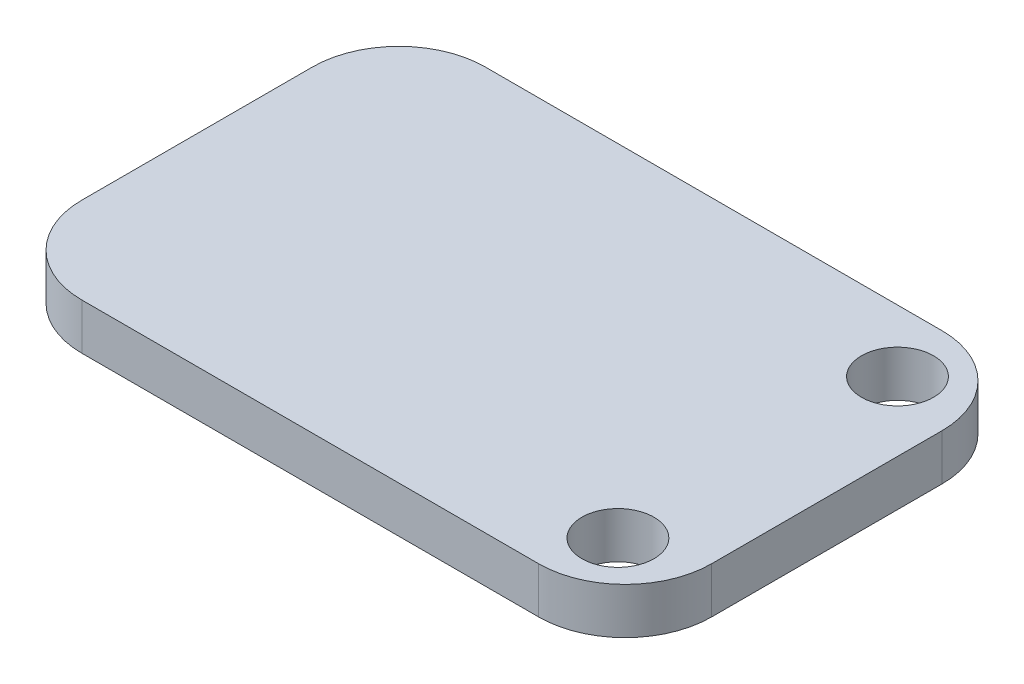
ISO-10303-21;
HEADER;
FILE_DESCRIPTION(('STEP AP214'),'2;1');
FILE_NAME('part.step','',(''),(''),'','','');
FILE_SCHEMA(('AUTOMOTIVE_DESIGN { 1 0 10303 214 1 1 1 1 }'));
ENDSEC;
DATA;
#1=APPLICATION_CONTEXT('core data for automotive mechanical design processes');
#2=APPLICATION_PROTOCOL_DEFINITION('international standard','automotive_design',2000,#1);
#3=PRODUCT_CONTEXT('',#1,'mechanical');
#4=PRODUCT('Part','Part','',(#3));
#5=PRODUCT_RELATED_PRODUCT_CATEGORY('part','',(#4));
#6=PRODUCT_DEFINITION_FORMATION('','',#4);
#7=PRODUCT_DEFINITION_CONTEXT('part definition',#1,'design');
#8=PRODUCT_DEFINITION('design','',#6,#7);
#9=PRODUCT_DEFINITION_SHAPE('','',#8);
#10=(LENGTH_UNIT() NAMED_UNIT(*) SI_UNIT(.MILLI.,.METRE.));
#11=(NAMED_UNIT(*) PLANE_ANGLE_UNIT() SI_UNIT($,.RADIAN.));
#12=(NAMED_UNIT(*) SI_UNIT($,.STERADIAN.) SOLID_ANGLE_UNIT());
#13=UNCERTAINTY_MEASURE_WITH_UNIT(LENGTH_MEASURE(1.E-05),#10,'distance_accuracy_value','');
#14=(GEOMETRIC_REPRESENTATION_CONTEXT(3) GLOBAL_UNCERTAINTY_ASSIGNED_CONTEXT((#13)) GLOBAL_UNIT_ASSIGNED_CONTEXT((#10,
#11,#12)) REPRESENTATION_CONTEXT('',''));
#15=CARTESIAN_POINT('',(0.,0.,0.));
#16=DIRECTION('',(0.,0.,1.));
#17=DIRECTION('',(1.,0.,0.));
#18=AXIS2_PLACEMENT_3D('',#15,#16,#17);
#19=CARTESIAN_POINT('',(-11.1,-1.6,-4.));
#20=DIRECTION('',(0.,1.,0.));
#21=DIRECTION('',(0.,0.,1.));
#22=AXIS2_PLACEMENT_3D('',#19,#20,#21);
#23=CYLINDRICAL_SURFACE('',#22,3.);
#24=CARTESIAN_POINT('',(-11.1,0.,-4.));
#25=DIRECTION('',(0.,1.,0.));
#26=DIRECTION('',(0.,0.,1.));
#27=AXIS2_PLACEMENT_3D('',#24,#25,#26);
#28=CIRCLE('',#27,3.);
#29=CARTESIAN_POINT('',(-11.1,0.,-7.));
#30=VERTEX_POINT('',#29);
#31=CARTESIAN_POINT('',(-14.1,0.,-3.99999999999998));
#32=VERTEX_POINT('',#31);
#33=EDGE_CURVE('E130',#30,#32,#28,.T.);
#34=ORIENTED_EDGE('',*,*,#33,.F.);
#35=DIRECTION('',(0.,1.,0.));
#36=VECTOR('',#35,1.);
#37=CARTESIAN_POINT('',(-11.1,-1.6,-7.));
#38=LINE('',#37,#36);
#39=CARTESIAN_POINT('',(-11.1,-1.6,-7.));
#40=VERTEX_POINT('',#39);
#41=EDGE_CURVE('E11',#40,#30,#38,.T.);
#42=ORIENTED_EDGE('',*,*,#41,.F.);
#43=CARTESIAN_POINT('',(-11.1,-1.6,-4.));
#44=DIRECTION('',(0.,1.,0.));
#45=DIRECTION('',(0.,0.,1.));
#46=AXIS2_PLACEMENT_3D('',#43,#44,#45);
#47=CIRCLE('',#46,3.);
#48=CARTESIAN_POINT('',(-14.1,-1.6,-3.99999999999998));
#49=VERTEX_POINT('',#48);
#50=EDGE_CURVE('E151',#40,#49,#47,.T.);
#51=ORIENTED_EDGE('',*,*,#50,.T.);
#52=DIRECTION('',(0.,1.,0.));
#53=VECTOR('',#52,1.);
#54=CARTESIAN_POINT('',(-14.1,-1.6,-3.99999999999998));
#55=LINE('',#54,#53);
#56=EDGE_CURVE('E36',#49,#32,#55,.T.);
#57=ORIENTED_EDGE('',*,*,#56,.T.);
#58=EDGE_LOOP('',(#34,#42,#51,#57));
#59=FACE_BOUND('',#58,.T.);
#60=ADVANCED_FACE('F33',(#59),#23,.T.);
#61=CARTESIAN_POINT('',(-11.1,-1.6,-7.));
#62=DIRECTION('',(0.,0.,-1.));
#63=DIRECTION('',(-1.,0.,0.));
#64=AXIS2_PLACEMENT_3D('',#61,#62,#63);
#65=PLANE('',#64);
#66=DIRECTION('',(-1.,0.,0.));
#67=VECTOR('',#66,1.);
#68=CARTESIAN_POINT('',(-11.1,0.,-7.));
#69=LINE('',#68,#67);
#70=CARTESIAN_POINT('',(4.74999999999998,0.,-7.));
#71=VERTEX_POINT('',#70);
#72=EDGE_CURVE('E149',#71,#30,#69,.T.);
#73=ORIENTED_EDGE('',*,*,#72,.F.);
#74=DIRECTION('',(0.,1.,0.));
#75=VECTOR('',#74,1.);
#76=CARTESIAN_POINT('',(4.74999999999998,-1.6,-7.));
#77=LINE('',#76,#75);
#78=CARTESIAN_POINT('',(4.74999999999998,-1.6,-7.));
#79=VERTEX_POINT('',#78);
#80=EDGE_CURVE('E42',#79,#71,#77,.T.);
#81=ORIENTED_EDGE('',*,*,#80,.F.);
#82=DIRECTION('',(-1.,0.,0.));
#83=VECTOR('',#82,1.);
#84=CARTESIAN_POINT('',(-11.1,-1.6,-7.));
#85=LINE('',#84,#83);
#86=EDGE_CURVE('E120',#79,#40,#85,.T.);
#87=ORIENTED_EDGE('',*,*,#86,.T.);
#88=ORIENTED_EDGE('',*,*,#41,.T.);
#89=EDGE_LOOP('',(#73,#81,#87,#88));
#90=FACE_BOUND('',#89,.T.);
#91=ADVANCED_FACE('F163',(#90),#65,.T.);
#92=CARTESIAN_POINT('',(4.75,-1.6,-4.));
#93=DIRECTION('',(0.,1.,0.));
#94=DIRECTION('',(0.,0.,1.));
#95=AXIS2_PLACEMENT_3D('',#92,#93,#94);
#96=CYLINDRICAL_SURFACE('',#95,3.);
#97=CARTESIAN_POINT('',(4.75,0.,-4.));
#98=DIRECTION('',(0.,1.,0.));
#99=DIRECTION('',(0.,0.,-1.));
#100=AXIS2_PLACEMENT_3D('',#97,#98,#99);
#101=CIRCLE('',#100,3.);
#102=CARTESIAN_POINT('',(7.75,0.,-3.99999999999998));
#103=VERTEX_POINT('',#102);
#104=EDGE_CURVE('E107',#103,#71,#101,.T.);
#105=ORIENTED_EDGE('',*,*,#104,.F.);
#106=DIRECTION('',(0.,1.,0.));
#107=VECTOR('',#106,1.);
#108=CARTESIAN_POINT('',(7.75,-1.6,-3.99999999999998));
#109=LINE('',#108,#107);
#110=CARTESIAN_POINT('',(7.75,-1.6,-3.99999999999998));
#111=VERTEX_POINT('',#110);
#112=EDGE_CURVE('E102',#111,#103,#109,.T.);
#113=ORIENTED_EDGE('',*,*,#112,.F.);
#114=CARTESIAN_POINT('',(4.75,-1.6,-4.));
#115=DIRECTION('',(0.,1.,0.));
#116=DIRECTION('',(0.,0.,-1.));
#117=AXIS2_PLACEMENT_3D('',#114,#115,#116);
#118=CIRCLE('',#117,3.);
#119=EDGE_CURVE('E105',#111,#79,#118,.T.);
#120=ORIENTED_EDGE('',*,*,#119,.T.);
#121=ORIENTED_EDGE('',*,*,#80,.T.);
#122=EDGE_LOOP('',(#105,#113,#120,#121));
#123=FACE_BOUND('',#122,.T.);
#124=ADVANCED_FACE('F104',(#123),#96,.T.);
#125=CARTESIAN_POINT('',(7.75,-1.6,-3.99999999999998));
#126=DIRECTION('',(1.,0.,0.));
#127=DIRECTION('',(0.,0.,-1.));
#128=AXIS2_PLACEMENT_3D('',#125,#126,#127);
#129=PLANE('',#128);
#130=DIRECTION('',(0.,0.,-1.));
#131=VECTOR('',#130,1.);
#132=CARTESIAN_POINT('',(7.75,0.,-3.99999999999998));
#133=LINE('',#132,#131);
#134=CARTESIAN_POINT('',(7.75,0.,3.99999999999998));
#135=VERTEX_POINT('',#134);
#136=EDGE_CURVE('E146',#135,#103,#133,.T.);
#137=ORIENTED_EDGE('',*,*,#136,.F.);
#138=DIRECTION('',(0.,1.,0.));
#139=VECTOR('',#138,1.);
#140=CARTESIAN_POINT('',(7.75,-1.6,3.99999999999998));
#141=LINE('',#140,#139);
#142=CARTESIAN_POINT('',(7.75,-1.6,3.99999999999998));
#143=VERTEX_POINT('',#142);
#144=EDGE_CURVE('E112',#143,#135,#141,.T.);
#145=ORIENTED_EDGE('',*,*,#144,.F.);
#146=DIRECTION('',(0.,0.,-1.));
#147=VECTOR('',#146,1.);
#148=CARTESIAN_POINT('',(7.75,-1.6,-3.99999999999998));
#149=LINE('',#148,#147);
#150=EDGE_CURVE('E118',#143,#111,#149,.T.);
#151=ORIENTED_EDGE('',*,*,#150,.T.);
#152=ORIENTED_EDGE('',*,*,#112,.T.);
#153=EDGE_LOOP('',(#137,#145,#151,#152));
#154=FACE_BOUND('',#153,.T.);
#155=ADVANCED_FACE('F122',(#154),#129,.T.);
#156=CARTESIAN_POINT('',(4.75,-1.6,4.));
#157=DIRECTION('',(0.,1.,0.));
#158=DIRECTION('',(0.,0.,1.));
#159=AXIS2_PLACEMENT_3D('',#156,#157,#158);
#160=CYLINDRICAL_SURFACE('',#159,3.);
#161=CARTESIAN_POINT('',(4.75,0.,4.));
#162=DIRECTION('',(0.,1.,0.));
#163=DIRECTION('',(0.,0.,1.));
#164=AXIS2_PLACEMENT_3D('',#161,#162,#163);
#165=CIRCLE('',#164,3.);
#166=CARTESIAN_POINT('',(4.74999999999998,0.,7.));
#167=VERTEX_POINT('',#166);
#168=EDGE_CURVE('E143',#167,#135,#165,.T.);
#169=ORIENTED_EDGE('',*,*,#168,.F.);
#170=DIRECTION('',(0.,1.,0.));
#171=VECTOR('',#170,1.);
#172=CARTESIAN_POINT('',(4.74999999999998,-1.6,7.));
#173=LINE('',#172,#171);
#174=CARTESIAN_POINT('',(4.74999999999998,-1.6,7.));
#175=VERTEX_POINT('',#174);
#176=EDGE_CURVE('E155',#175,#167,#173,.T.);
#177=ORIENTED_EDGE('',*,*,#176,.F.);
#178=CARTESIAN_POINT('',(4.75,-1.6,4.));
#179=DIRECTION('',(0.,1.,0.));
#180=DIRECTION('',(0.,0.,1.));
#181=AXIS2_PLACEMENT_3D('',#178,#179,#180);
#182=CIRCLE('',#181,3.);
#183=EDGE_CURVE('E123',#175,#143,#182,.T.);
#184=ORIENTED_EDGE('',*,*,#183,.T.);
#185=ORIENTED_EDGE('',*,*,#144,.T.);
#186=EDGE_LOOP('',(#169,#177,#184,#185));
#187=FACE_BOUND('',#186,.T.);
#188=ADVANCED_FACE('F176',(#187),#160,.T.);
#189=CARTESIAN_POINT('',(-11.1,-1.6,7.));
#190=DIRECTION('',(0.,0.,1.));
#191=DIRECTION('',(1.,0.,0.));
#192=AXIS2_PLACEMENT_3D('',#189,#190,#191);
#193=PLANE('',#192);
#194=DIRECTION('',(1.,0.,0.));
#195=VECTOR('',#194,1.);
#196=CARTESIAN_POINT('',(-11.1,0.,7.));
#197=LINE('',#196,#195);
#198=CARTESIAN_POINT('',(-11.1,0.,7.));
#199=VERTEX_POINT('',#198);
#200=EDGE_CURVE('E140',#199,#167,#197,.T.);
#201=ORIENTED_EDGE('',*,*,#200,.F.);
#202=DIRECTION('',(0.,1.,0.));
#203=VECTOR('',#202,1.);
#204=CARTESIAN_POINT('',(-11.1,-1.6,7.));
#205=LINE('',#204,#203);
#206=CARTESIAN_POINT('',(-11.1,-1.6,7.));
#207=VERTEX_POINT('',#206);
#208=EDGE_CURVE('E157',#207,#199,#205,.T.);
#209=ORIENTED_EDGE('',*,*,#208,.F.);
#210=DIRECTION('',(1.,0.,0.));
#211=VECTOR('',#210,1.);
#212=CARTESIAN_POINT('',(-11.1,-1.6,7.));
#213=LINE('',#212,#211);
#214=EDGE_CURVE('E125',#207,#175,#213,.T.);
#215=ORIENTED_EDGE('',*,*,#214,.T.);
#216=ORIENTED_EDGE('',*,*,#176,.T.);
#217=EDGE_LOOP('',(#201,#209,#215,#216));
#218=FACE_BOUND('',#217,.T.);
#219=ADVANCED_FACE('F179',(#218),#193,.T.);
#220=CARTESIAN_POINT('',(-11.1,-1.6,4.));
#221=DIRECTION('',(0.,1.,0.));
#222=DIRECTION('',(0.,0.,1.));
#223=AXIS2_PLACEMENT_3D('',#220,#221,#222);
#224=CYLINDRICAL_SURFACE('',#223,3.);
#225=CARTESIAN_POINT('',(-11.1,0.,4.));
#226=DIRECTION('',(0.,1.,0.));
#227=DIRECTION('',(0.,0.,1.));
#228=AXIS2_PLACEMENT_3D('',#225,#226,#227);
#229=CIRCLE('',#228,3.);
#230=CARTESIAN_POINT('',(-14.1,0.,3.99999999999998));
#231=VERTEX_POINT('',#230);
#232=EDGE_CURVE('E137',#231,#199,#229,.T.);
#233=ORIENTED_EDGE('',*,*,#232,.F.);
#234=DIRECTION('',(0.,1.,0.));
#235=VECTOR('',#234,1.);
#236=CARTESIAN_POINT('',(-14.1,-1.6,3.99999999999998));
#237=LINE('',#236,#235);
#238=CARTESIAN_POINT('',(-14.1,-1.6,3.99999999999998));
#239=VERTEX_POINT('',#238);
#240=EDGE_CURVE('E158',#239,#231,#237,.T.);
#241=ORIENTED_EDGE('',*,*,#240,.F.);
#242=CARTESIAN_POINT('',(-11.1,-1.6,4.));
#243=DIRECTION('',(0.,1.,0.));
#244=DIRECTION('',(0.,0.,1.));
#245=AXIS2_PLACEMENT_3D('',#242,#243,#244);
#246=CIRCLE('',#245,3.);
#247=EDGE_CURVE('E225',#239,#207,#246,.T.);
#248=ORIENTED_EDGE('',*,*,#247,.T.);
#249=ORIENTED_EDGE('',*,*,#208,.T.);
#250=EDGE_LOOP('',(#233,#241,#248,#249));
#251=FACE_BOUND('',#250,.T.);
#252=ADVANCED_FACE('F183',(#251),#224,.T.);
#253=CARTESIAN_POINT('',(-14.1,-1.6,-3.99999999999998));
#254=DIRECTION('',(-1.,0.,0.));
#255=DIRECTION('',(0.,0.,1.));
#256=AXIS2_PLACEMENT_3D('',#253,#254,#255);
#257=PLANE('',#256);
#258=DIRECTION('',(0.,0.,1.));
#259=VECTOR('',#258,1.);
#260=CARTESIAN_POINT('',(-14.1,0.,-3.99999999999998));
#261=LINE('',#260,#259);
#262=EDGE_CURVE('E133',#32,#231,#261,.T.);
#263=ORIENTED_EDGE('',*,*,#262,.F.);
#264=ORIENTED_EDGE('',*,*,#56,.F.);
#265=DIRECTION('',(0.,0.,1.));
#266=VECTOR('',#265,1.);
#267=CARTESIAN_POINT('',(-14.1,-1.6,-3.99999999999998));
#268=LINE('',#267,#266);
#269=EDGE_CURVE('E223',#49,#239,#268,.T.);
#270=ORIENTED_EDGE('',*,*,#269,.T.);
#271=ORIENTED_EDGE('',*,*,#240,.T.);
#272=EDGE_LOOP('',(#263,#264,#270,#271));
#273=FACE_BOUND('',#272,.T.);
#274=ADVANCED_FACE('F160',(#273),#257,.T.);
#275=CARTESIAN_POINT('',(-11.1,-1.6,-4.));
#276=DIRECTION('',(0.,1.,0.));
#277=DIRECTION('',(0.,0.,1.));
#278=AXIS2_PLACEMENT_3D('',#275,#276,#277);
#279=PLANE('',#278);
#280=CARTESIAN_POINT('',(5.35,-1.6,4.85));
#281=DIRECTION('',(0.,1.,0.));
#282=DIRECTION('',(0.,0.,1.));
#283=AXIS2_PLACEMENT_3D('',#280,#281,#282);
#284=CIRCLE('',#283,1.25);
#285=CARTESIAN_POINT('',(5.35,-1.6,6.1));
#286=VERTEX_POINT('',#285);
#287=EDGE_CURVE('E210',#286,#286,#284,.T.);
#288=ORIENTED_EDGE('',*,*,#287,.T.);
#289=EDGE_LOOP('',(#288));
#290=FACE_BOUND('',#289,.T.);
#291=CARTESIAN_POINT('',(5.35,-1.6,-4.85));
#292=DIRECTION('',(0.,1.,0.));
#293=DIRECTION('',(0.,0.,1.));
#294=AXIS2_PLACEMENT_3D('',#291,#292,#293);
#295=CIRCLE('',#294,1.25);
#296=CARTESIAN_POINT('',(5.35,-1.6,-3.6));
#297=VERTEX_POINT('',#296);
#298=EDGE_CURVE('E134',#297,#297,#295,.T.);
#299=ORIENTED_EDGE('',*,*,#298,.T.);
#300=EDGE_LOOP('',(#299));
#301=FACE_BOUND('',#300,.T.);
#302=ORIENTED_EDGE('',*,*,#50,.F.);
#303=ORIENTED_EDGE('',*,*,#86,.F.);
#304=ORIENTED_EDGE('',*,*,#119,.F.);
#305=ORIENTED_EDGE('',*,*,#150,.F.);
#306=ORIENTED_EDGE('',*,*,#183,.F.);
#307=ORIENTED_EDGE('',*,*,#214,.F.);
#308=ORIENTED_EDGE('',*,*,#247,.F.);
#309=ORIENTED_EDGE('',*,*,#269,.F.);
#310=EDGE_LOOP('',(#302,#303,#304,#305,#306,#307,#308,#309));
#311=FACE_BOUND('',#310,.T.);
#312=ADVANCED_FACE('F116',(#290,#301,#311),#279,.F.);
#313=CARTESIAN_POINT('',(-11.1,0.,-4.));
#314=DIRECTION('',(0.,1.,0.));
#315=DIRECTION('',(0.,0.,1.));
#316=AXIS2_PLACEMENT_3D('',#313,#314,#315);
#317=PLANE('',#316);
#318=CARTESIAN_POINT('',(5.35,0.,4.85));
#319=DIRECTION('',(0.,1.,0.));
#320=DIRECTION('',(0.,0.,1.));
#321=AXIS2_PLACEMENT_3D('',#318,#319,#320);
#322=CIRCLE('',#321,1.25);
#323=CARTESIAN_POINT('',(5.35,0.,6.1));
#324=VERTEX_POINT('',#323);
#325=EDGE_CURVE('E213',#324,#324,#322,.T.);
#326=ORIENTED_EDGE('',*,*,#325,.F.);
#327=EDGE_LOOP('',(#326));
#328=FACE_BOUND('',#327,.T.);
#329=CARTESIAN_POINT('',(5.35,0.,-4.85));
#330=DIRECTION('',(0.,1.,0.));
#331=DIRECTION('',(0.,0.,1.));
#332=AXIS2_PLACEMENT_3D('',#329,#330,#331);
#333=CIRCLE('',#332,1.25);
#334=CARTESIAN_POINT('',(5.35,0.,-3.6));
#335=VERTEX_POINT('',#334);
#336=EDGE_CURVE('E215',#335,#335,#333,.T.);
#337=ORIENTED_EDGE('',*,*,#336,.F.);
#338=EDGE_LOOP('',(#337));
#339=FACE_BOUND('',#338,.T.);
#340=ORIENTED_EDGE('',*,*,#33,.T.);
#341=ORIENTED_EDGE('',*,*,#262,.T.);
#342=ORIENTED_EDGE('',*,*,#232,.T.);
#343=ORIENTED_EDGE('',*,*,#200,.T.);
#344=ORIENTED_EDGE('',*,*,#168,.T.);
#345=ORIENTED_EDGE('',*,*,#136,.T.);
#346=ORIENTED_EDGE('',*,*,#104,.T.);
#347=ORIENTED_EDGE('',*,*,#72,.T.);
#348=EDGE_LOOP('',(#340,#341,#342,#343,#344,#345,#346,#347));
#349=FACE_BOUND('',#348,.T.);
#350=ADVANCED_FACE('F162',(#328,#339,#349),#317,.T.);
#351=CARTESIAN_POINT('',(5.35,-1.6,-4.85));
#352=DIRECTION('',(0.,1.,0.));
#353=DIRECTION('',(0.,0.,1.));
#354=AXIS2_PLACEMENT_3D('',#351,#352,#353);
#355=CYLINDRICAL_SURFACE('',#354,1.25);
#356=ORIENTED_EDGE('',*,*,#298,.F.);
#357=EDGE_LOOP('',(#356));
#358=FACE_BOUND('',#357,.T.);
#359=ORIENTED_EDGE('',*,*,#336,.T.);
#360=EDGE_LOOP('',(#359));
#361=FACE_BOUND('',#360,.T.);
#362=ADVANCED_FACE('F195',(#358,#361),#355,.F.);
#363=CARTESIAN_POINT('',(5.35,-1.6,4.85));
#364=DIRECTION('',(0.,1.,0.));
#365=DIRECTION('',(0.,0.,1.));
#366=AXIS2_PLACEMENT_3D('',#363,#364,#365);
#367=CYLINDRICAL_SURFACE('',#366,1.25);
#368=ORIENTED_EDGE('',*,*,#287,.F.);
#369=EDGE_LOOP('',(#368));
#370=FACE_BOUND('',#369,.T.);
#371=ORIENTED_EDGE('',*,*,#325,.T.);
#372=EDGE_LOOP('',(#371));
#373=FACE_BOUND('',#372,.T.);
#374=ADVANCED_FACE('F202',(#370,#373),#367,.F.);
#375=CLOSED_SHELL('',(#60,#91,#124,#155,#188,#219,#252,#274,#312,#350,#362,#374));
#376=MANIFOLD_SOLID_BREP('B2',#375);
#377=ADVANCED_BREP_SHAPE_REPRESENTATION('',(#18,#376),#14);
#378=SHAPE_DEFINITION_REPRESENTATION(#9,#377);
ENDSEC;
END-ISO-10303-21;
